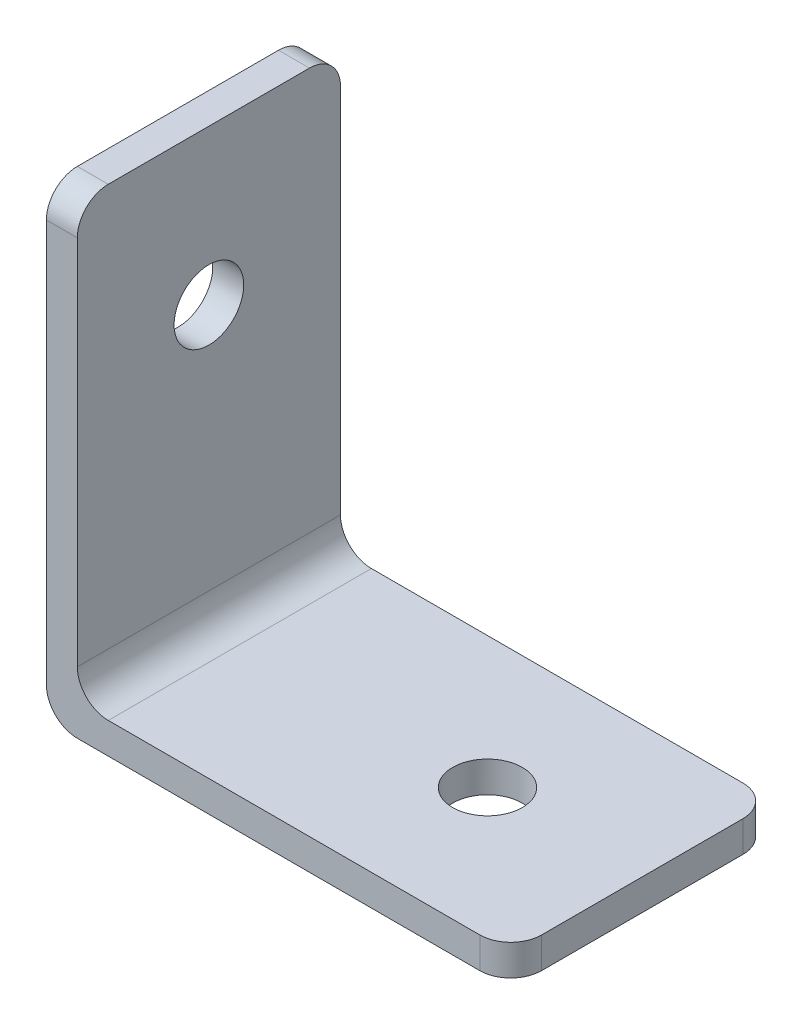
ISO-10303-21;
HEADER;
FILE_DESCRIPTION(('STEP AP214'),'2;1');
FILE_NAME('part.step','',(''),(''),'','','');
FILE_SCHEMA(('AUTOMOTIVE_DESIGN { 1 0 10303 214 1 1 1 1 }'));
ENDSEC;
DATA;
#1=APPLICATION_CONTEXT('core data for automotive mechanical design processes');
#2=APPLICATION_PROTOCOL_DEFINITION('international standard','automotive_design',2000,#1);
#3=PRODUCT_CONTEXT('',#1,'mechanical');
#4=PRODUCT('Part','Part','',(#3));
#5=PRODUCT_RELATED_PRODUCT_CATEGORY('part','',(#4));
#6=PRODUCT_DEFINITION_FORMATION('','',#4);
#7=PRODUCT_DEFINITION_CONTEXT('part definition',#1,'design');
#8=PRODUCT_DEFINITION('design','',#6,#7);
#9=PRODUCT_DEFINITION_SHAPE('','',#8);
#10=(LENGTH_UNIT() NAMED_UNIT(*) SI_UNIT(.MILLI.,.METRE.));
#11=(NAMED_UNIT(*) PLANE_ANGLE_UNIT() SI_UNIT($,.RADIAN.));
#12=(NAMED_UNIT(*) SI_UNIT($,.STERADIAN.) SOLID_ANGLE_UNIT());
#13=UNCERTAINTY_MEASURE_WITH_UNIT(LENGTH_MEASURE(1.E-05),#10,'distance_accuracy_value','');
#14=(GEOMETRIC_REPRESENTATION_CONTEXT(3) GLOBAL_UNCERTAINTY_ASSIGNED_CONTEXT((#13)) GLOBAL_UNIT_ASSIGNED_CONTEXT((#10,
#11,#12)) REPRESENTATION_CONTEXT('',''));
#15=CARTESIAN_POINT('',(0.,0.,0.));
#16=DIRECTION('',(0.,0.,1.));
#17=DIRECTION('',(1.,0.,0.));
#18=AXIS2_PLACEMENT_3D('',#15,#16,#17);
#19=CARTESIAN_POINT('',(0.,0.,17.));
#20=DIRECTION('',(0.,1.,0.));
#21=DIRECTION('',(0.,0.,1.));
#22=AXIS2_PLACEMENT_3D('',#19,#20,#21);
#23=PLANE('',#22);
#24=CARTESIAN_POINT('',(20.,0.,8.5));
#25=DIRECTION('',(0.,-1.,0.));
#26=DIRECTION('',(0.,0.,-1.));
#27=AXIS2_PLACEMENT_3D('',#24,#25,#26);
#28=CIRCLE('',#27,2.25);
#29=CARTESIAN_POINT('',(20.,0.,6.25));
#30=VERTEX_POINT('',#29);
#31=EDGE_CURVE('E394',#30,#30,#28,.T.);
#32=ORIENTED_EDGE('',*,*,#31,.F.);
#33=EDGE_LOOP('',(#32));
#34=FACE_BOUND('',#33,.T.);
#35=DIRECTION('',(1.,0.,0.));
#36=VECTOR('',#35,1.);
#37=CARTESIAN_POINT('',(0.,0.,17.));
#38=LINE('',#37,#36);
#39=CARTESIAN_POINT('',(2.,0.,17.));
#40=VERTEX_POINT('',#39);
#41=CARTESIAN_POINT('',(28.,0.,17.));
#42=VERTEX_POINT('',#41);
#43=EDGE_CURVE('E215',#40,#42,#38,.T.);
#44=ORIENTED_EDGE('',*,*,#43,.F.);
#45=DIRECTION('',(0.,0.,-1.));
#46=VECTOR('',#45,1.);
#47=CARTESIAN_POINT('',(2.,0.,17.));
#48=LINE('',#47,#46);
#49=CARTESIAN_POINT('',(2.,0.,0.));
#50=VERTEX_POINT('',#49);
#51=EDGE_CURVE('E180',#40,#50,#48,.T.);
#52=ORIENTED_EDGE('',*,*,#51,.T.);
#53=DIRECTION('',(1.,0.,0.));
#54=VECTOR('',#53,1.);
#55=CARTESIAN_POINT('',(0.,0.,0.));
#56=LINE('',#55,#54);
#57=CARTESIAN_POINT('',(28.,0.,0.));
#58=VERTEX_POINT('',#57);
#59=EDGE_CURVE('E203',#50,#58,#56,.T.);
#60=ORIENTED_EDGE('',*,*,#59,.T.);
#61=CARTESIAN_POINT('',(28.,0.,2.));
#62=DIRECTION('',(0.,1.,0.));
#63=DIRECTION('',(0.,0.,1.));
#64=AXIS2_PLACEMENT_3D('',#61,#62,#63);
#65=CIRCLE('',#64,2.);
#66=CARTESIAN_POINT('',(30.,0.,2.));
#67=VERTEX_POINT('',#66);
#68=EDGE_CURVE('E150',#58,#67,#65,.F.);
#69=ORIENTED_EDGE('',*,*,#68,.T.);
#70=DIRECTION('',(0.,0.,-1.));
#71=VECTOR('',#70,1.);
#72=CARTESIAN_POINT('',(30.,0.,17.));
#73=LINE('',#72,#71);
#74=CARTESIAN_POINT('',(30.,0.,15.));
#75=VERTEX_POINT('',#74);
#76=EDGE_CURVE('E144',#75,#67,#73,.T.);
#77=ORIENTED_EDGE('',*,*,#76,.F.);
#78=CARTESIAN_POINT('',(28.,0.,15.));
#79=DIRECTION('',(0.,1.,0.));
#80=DIRECTION('',(0.,0.,1.));
#81=AXIS2_PLACEMENT_3D('',#78,#79,#80);
#82=CIRCLE('',#81,2.);
#83=EDGE_CURVE('E149',#75,#42,#82,.F.);
#84=ORIENTED_EDGE('',*,*,#83,.T.);
#85=EDGE_LOOP('',(#44,#52,#60,#69,#77,#84));
#86=FACE_BOUND('',#85,.T.);
#87=ADVANCED_FACE('F33',(#34,#86),#23,.F.);
#88=CARTESIAN_POINT('',(30.,2.,17.));
#89=DIRECTION('',(1.,0.,0.));
#90=DIRECTION('',(0.,0.,-1.));
#91=AXIS2_PLACEMENT_3D('',#88,#89,#90);
#92=PLANE('',#91);
#93=DIRECTION('',(0.,0.,-1.));
#94=VECTOR('',#93,1.);
#95=CARTESIAN_POINT('',(30.,2.,17.));
#96=LINE('',#95,#94);
#97=CARTESIAN_POINT('',(30.,2.,15.));
#98=VERTEX_POINT('',#97);
#99=CARTESIAN_POINT('',(30.,2.,2.));
#100=VERTEX_POINT('',#99);
#101=EDGE_CURVE('E126',#98,#100,#96,.T.);
#102=ORIENTED_EDGE('',*,*,#101,.F.);
#103=DIRECTION('',(0.,-1.,0.));
#104=VECTOR('',#103,1.);
#105=CARTESIAN_POINT('',(30.,0.,15.));
#106=LINE('',#105,#104);
#107=EDGE_CURVE('E140',#98,#75,#106,.T.);
#108=ORIENTED_EDGE('',*,*,#107,.T.);
#109=ORIENTED_EDGE('',*,*,#76,.T.);
#110=DIRECTION('',(0.,-1.,0.));
#111=VECTOR('',#110,1.);
#112=CARTESIAN_POINT('',(30.,2.,2.));
#113=LINE('',#112,#111);
#114=EDGE_CURVE('E143',#67,#100,#113,.F.);
#115=ORIENTED_EDGE('',*,*,#114,.T.);
#116=EDGE_LOOP('',(#102,#108,#109,#115));
#117=FACE_BOUND('',#116,.T.);
#118=ADVANCED_FACE('F138',(#117),#92,.T.);
#119=CARTESIAN_POINT('',(0.,2.,17.));
#120=DIRECTION('',(0.,1.,0.));
#121=DIRECTION('',(0.,0.,1.));
#122=AXIS2_PLACEMENT_3D('',#119,#120,#121);
#123=PLANE('',#122);
#124=CARTESIAN_POINT('',(20.,2.,8.5));
#125=DIRECTION('',(0.,1.,0.));
#126=DIRECTION('',(0.,0.,1.));
#127=AXIS2_PLACEMENT_3D('',#124,#125,#126);
#128=CIRCLE('',#127,2.25);
#129=CARTESIAN_POINT('',(20.,2.,10.75));
#130=VERTEX_POINT('',#129);
#131=EDGE_CURVE('E37',#130,#130,#128,.T.);
#132=ORIENTED_EDGE('',*,*,#131,.F.);
#133=EDGE_LOOP('',(#132));
#134=FACE_BOUND('',#133,.T.);
#135=DIRECTION('',(1.,0.,0.));
#136=VECTOR('',#135,1.);
#137=CARTESIAN_POINT('',(0.,2.,0.));
#138=LINE('',#137,#136);
#139=CARTESIAN_POINT('',(4.,2.,0.));
#140=VERTEX_POINT('',#139);
#141=CARTESIAN_POINT('',(28.,2.,0.));
#142=VERTEX_POINT('',#141);
#143=EDGE_CURVE('E197',#140,#142,#138,.T.);
#144=ORIENTED_EDGE('',*,*,#143,.F.);
#145=DIRECTION('',(0.,0.,-1.));
#146=VECTOR('',#145,1.);
#147=CARTESIAN_POINT('',(4.,2.,17.));
#148=LINE('',#147,#146);
#149=CARTESIAN_POINT('',(4.,2.,17.));
#150=VERTEX_POINT('',#149);
#151=EDGE_CURVE('E55',#140,#150,#148,.F.);
#152=ORIENTED_EDGE('',*,*,#151,.T.);
#153=DIRECTION('',(1.,0.,0.));
#154=VECTOR('',#153,1.);
#155=CARTESIAN_POINT('',(0.,2.,17.));
#156=LINE('',#155,#154);
#157=CARTESIAN_POINT('',(28.,2.,17.));
#158=VERTEX_POINT('',#157);
#159=EDGE_CURVE('E128',#150,#158,#156,.T.);
#160=ORIENTED_EDGE('',*,*,#159,.T.);
#161=CARTESIAN_POINT('',(28.,2.,15.));
#162=DIRECTION('',(0.,1.,0.));
#163=DIRECTION('',(0.,0.,1.));
#164=AXIS2_PLACEMENT_3D('',#161,#162,#163);
#165=CIRCLE('',#164,2.);
#166=EDGE_CURVE('E122',#158,#98,#165,.T.);
#167=ORIENTED_EDGE('',*,*,#166,.T.);
#168=ORIENTED_EDGE('',*,*,#101,.T.);
#169=CARTESIAN_POINT('',(28.,2.,2.));
#170=DIRECTION('',(0.,1.,0.));
#171=DIRECTION('',(0.,0.,1.));
#172=AXIS2_PLACEMENT_3D('',#169,#170,#171);
#173=CIRCLE('',#172,2.);
#174=EDGE_CURVE('E134',#100,#142,#173,.T.);
#175=ORIENTED_EDGE('',*,*,#174,.T.);
#176=EDGE_LOOP('',(#144,#152,#160,#167,#168,#175));
#177=FACE_BOUND('',#176,.T.);
#178=ADVANCED_FACE('F124',(#134,#177),#123,.T.);
#179=CARTESIAN_POINT('',(2.,30.,17.));
#180=DIRECTION('',(1.,0.,0.));
#181=DIRECTION('',(0.,0.,-1.));
#182=AXIS2_PLACEMENT_3D('',#179,#180,#181);
#183=PLANE('',#182);
#184=CARTESIAN_POINT('',(2.,20.,8.5));
#185=DIRECTION('',(1.,0.,0.));
#186=DIRECTION('',(0.,0.,-1.));
#187=AXIS2_PLACEMENT_3D('',#184,#185,#186);
#188=CIRCLE('',#187,2.25);
#189=CARTESIAN_POINT('',(2.,20.,6.25));
#190=VERTEX_POINT('',#189);
#191=EDGE_CURVE('E219',#190,#190,#188,.T.);
#192=ORIENTED_EDGE('',*,*,#191,.F.);
#193=EDGE_LOOP('',(#192));
#194=FACE_BOUND('',#193,.T.);
#195=DIRECTION('',(0.,1.,0.));
#196=VECTOR('',#195,1.);
#197=CARTESIAN_POINT('',(2.,30.,17.));
#198=LINE('',#197,#196);
#199=CARTESIAN_POINT('',(2.,28.,17.));
#200=VERTEX_POINT('',#199);
#201=CARTESIAN_POINT('',(2.,4.,17.));
#202=VERTEX_POINT('',#201);
#203=EDGE_CURVE('E207',#200,#202,#198,.F.);
#204=ORIENTED_EDGE('',*,*,#203,.T.);
#205=DIRECTION('',(0.,0.,-1.));
#206=VECTOR('',#205,1.);
#207=CARTESIAN_POINT('',(2.,4.,0.));
#208=LINE('',#207,#206);
#209=CARTESIAN_POINT('',(2.,4.,0.));
#210=VERTEX_POINT('',#209);
#211=EDGE_CURVE('E189',#202,#210,#208,.T.);
#212=ORIENTED_EDGE('',*,*,#211,.T.);
#213=DIRECTION('',(0.,1.,0.));
#214=VECTOR('',#213,1.);
#215=CARTESIAN_POINT('',(2.,30.,0.));
#216=LINE('',#215,#214);
#217=CARTESIAN_POINT('',(2.,28.,0.));
#218=VERTEX_POINT('',#217);
#219=EDGE_CURVE('E199',#218,#210,#216,.F.);
#220=ORIENTED_EDGE('',*,*,#219,.F.);
#221=CARTESIAN_POINT('',(2.,28.,2.));
#222=DIRECTION('',(1.,0.,0.));
#223=DIRECTION('',(0.,0.,-1.));
#224=AXIS2_PLACEMENT_3D('',#221,#222,#223);
#225=CIRCLE('',#224,2.);
#226=CARTESIAN_POINT('',(2.,30.,2.));
#227=VERTEX_POINT('',#226);
#228=EDGE_CURVE('E172',#218,#227,#225,.T.);
#229=ORIENTED_EDGE('',*,*,#228,.T.);
#230=DIRECTION('',(0.,0.,-1.));
#231=VECTOR('',#230,1.);
#232=CARTESIAN_POINT('',(2.,30.,17.));
#233=LINE('',#232,#231);
#234=CARTESIAN_POINT('',(2.,30.,15.));
#235=VERTEX_POINT('',#234);
#236=EDGE_CURVE('E145',#235,#227,#233,.T.);
#237=ORIENTED_EDGE('',*,*,#236,.F.);
#238=CARTESIAN_POINT('',(2.,28.,15.));
#239=DIRECTION('',(1.,0.,0.));
#240=DIRECTION('',(0.,0.,-1.));
#241=AXIS2_PLACEMENT_3D('',#238,#239,#240);
#242=CIRCLE('',#241,2.);
#243=EDGE_CURVE('E174',#235,#200,#242,.T.);
#244=ORIENTED_EDGE('',*,*,#243,.T.);
#245=EDGE_LOOP('',(#204,#212,#220,#229,#237,#244));
#246=FACE_BOUND('',#245,.T.);
#247=ADVANCED_FACE('F206',(#194,#246),#183,.T.);
#248=CARTESIAN_POINT('',(0.,30.,17.));
#249=DIRECTION('',(0.,1.,0.));
#250=DIRECTION('',(0.,0.,1.));
#251=AXIS2_PLACEMENT_3D('',#248,#249,#250);
#252=PLANE('',#251);
#253=DIRECTION('',(0.,0.,-1.));
#254=VECTOR('',#253,1.);
#255=CARTESIAN_POINT('',(0.,30.,17.));
#256=LINE('',#255,#254);
#257=CARTESIAN_POINT('',(0.,30.,15.));
#258=VERTEX_POINT('',#257);
#259=CARTESIAN_POINT('',(0.,30.,2.));
#260=VERTEX_POINT('',#259);
#261=EDGE_CURVE('E213',#258,#260,#256,.T.);
#262=ORIENTED_EDGE('',*,*,#261,.F.);
#263=DIRECTION('',(1.,0.,0.));
#264=VECTOR('',#263,1.);
#265=CARTESIAN_POINT('',(2.,30.,15.));
#266=LINE('',#265,#264);
#267=EDGE_CURVE('E169',#258,#235,#266,.T.);
#268=ORIENTED_EDGE('',*,*,#267,.T.);
#269=ORIENTED_EDGE('',*,*,#236,.T.);
#270=DIRECTION('',(1.,0.,0.));
#271=VECTOR('',#270,1.);
#272=CARTESIAN_POINT('',(0.,30.,2.));
#273=LINE('',#272,#271);
#274=EDGE_CURVE('E167',#227,#260,#273,.F.);
#275=ORIENTED_EDGE('',*,*,#274,.T.);
#276=EDGE_LOOP('',(#262,#268,#269,#275));
#277=FACE_BOUND('',#276,.T.);
#278=ADVANCED_FACE('F250',(#277),#252,.T.);
#279=CARTESIAN_POINT('',(0.,30.,17.));
#280=DIRECTION('',(1.,0.,0.));
#281=DIRECTION('',(0.,0.,-1.));
#282=AXIS2_PLACEMENT_3D('',#279,#280,#281);
#283=PLANE('',#282);
#284=CARTESIAN_POINT('',(0.,20.,8.5));
#285=DIRECTION('',(-1.,0.,0.));
#286=DIRECTION('',(0.,0.,1.));
#287=AXIS2_PLACEMENT_3D('',#284,#285,#286);
#288=CIRCLE('',#287,2.25);
#289=CARTESIAN_POINT('',(0.,20.,10.75));
#290=VERTEX_POINT('',#289);
#291=EDGE_CURVE('E396',#290,#290,#288,.T.);
#292=ORIENTED_EDGE('',*,*,#291,.F.);
#293=EDGE_LOOP('',(#292));
#294=FACE_BOUND('',#293,.T.);
#295=DIRECTION('',(0.,-1.,0.));
#296=VECTOR('',#295,1.);
#297=CARTESIAN_POINT('',(0.,30.,0.));
#298=LINE('',#297,#296);
#299=CARTESIAN_POINT('',(0.,28.,0.));
#300=VERTEX_POINT('',#299);
#301=CARTESIAN_POINT('',(0.,2.,0.));
#302=VERTEX_POINT('',#301);
#303=EDGE_CURVE('E222',#300,#302,#298,.T.);
#304=ORIENTED_EDGE('',*,*,#303,.T.);
#305=DIRECTION('',(0.,0.,-1.));
#306=VECTOR('',#305,1.);
#307=CARTESIAN_POINT('',(0.,2.,17.));
#308=LINE('',#307,#306);
#309=CARTESIAN_POINT('',(0.,2.,17.));
#310=VERTEX_POINT('',#309);
#311=EDGE_CURVE('E185',#302,#310,#308,.F.);
#312=ORIENTED_EDGE('',*,*,#311,.T.);
#313=DIRECTION('',(0.,-1.,0.));
#314=VECTOR('',#313,1.);
#315=CARTESIAN_POINT('',(0.,30.,17.));
#316=LINE('',#315,#314);
#317=CARTESIAN_POINT('',(0.,28.,17.));
#318=VERTEX_POINT('',#317);
#319=EDGE_CURVE('E210',#318,#310,#316,.T.);
#320=ORIENTED_EDGE('',*,*,#319,.F.);
#321=CARTESIAN_POINT('',(0.,28.,15.));
#322=DIRECTION('',(1.,0.,0.));
#323=DIRECTION('',(0.,0.,-1.));
#324=AXIS2_PLACEMENT_3D('',#321,#322,#323);
#325=CIRCLE('',#324,2.);
#326=EDGE_CURVE('E178',#318,#258,#325,.F.);
#327=ORIENTED_EDGE('',*,*,#326,.T.);
#328=ORIENTED_EDGE('',*,*,#261,.T.);
#329=CARTESIAN_POINT('',(0.,28.,2.));
#330=DIRECTION('',(1.,0.,0.));
#331=DIRECTION('',(0.,0.,-1.));
#332=AXIS2_PLACEMENT_3D('',#329,#330,#331);
#333=CIRCLE('',#332,2.);
#334=EDGE_CURVE('E176',#260,#300,#333,.F.);
#335=ORIENTED_EDGE('',*,*,#334,.T.);
#336=EDGE_LOOP('',(#304,#312,#320,#327,#328,#335));
#337=FACE_BOUND('',#336,.T.);
#338=ADVANCED_FACE('F241',(#294,#337),#283,.F.);
#339=CARTESIAN_POINT('',(0.,0.,17.));
#340=DIRECTION('',(0.,0.,-1.));
#341=DIRECTION('',(-1.,0.,0.));
#342=AXIS2_PLACEMENT_3D('',#339,#340,#341);
#343=PLANE('',#342);
#344=ORIENTED_EDGE('',*,*,#319,.T.);
#345=CARTESIAN_POINT('',(2.,2.,17.));
#346=DIRECTION('',(0.,0.,-1.));
#347=DIRECTION('',(-1.,0.,0.));
#348=AXIS2_PLACEMENT_3D('',#345,#346,#347);
#349=CIRCLE('',#348,2.);
#350=EDGE_CURVE('E187',#310,#40,#349,.F.);
#351=ORIENTED_EDGE('',*,*,#350,.T.);
#352=ORIENTED_EDGE('',*,*,#43,.T.);
#353=DIRECTION('',(0.,-1.,0.));
#354=VECTOR('',#353,1.);
#355=CARTESIAN_POINT('',(28.,2.,17.));
#356=LINE('',#355,#354);
#357=EDGE_CURVE('E159',#42,#158,#356,.F.);
#358=ORIENTED_EDGE('',*,*,#357,.T.);
#359=ORIENTED_EDGE('',*,*,#159,.F.);
#360=CARTESIAN_POINT('',(4.,4.,17.));
#361=DIRECTION('',(0.,0.,-1.));
#362=DIRECTION('',(-1.,0.,0.));
#363=AXIS2_PLACEMENT_3D('',#360,#361,#362);
#364=CIRCLE('',#363,2.);
#365=EDGE_CURVE('E11',#150,#202,#364,.T.);
#366=ORIENTED_EDGE('',*,*,#365,.T.);
#367=ORIENTED_EDGE('',*,*,#203,.F.);
#368=DIRECTION('',(1.,0.,0.));
#369=VECTOR('',#368,1.);
#370=CARTESIAN_POINT('',(0.,28.,17.));
#371=LINE('',#370,#369);
#372=EDGE_CURVE('E157',#200,#318,#371,.F.);
#373=ORIENTED_EDGE('',*,*,#372,.T.);
#374=EDGE_LOOP('',(#344,#351,#352,#358,#359,#366,#367,#373));
#375=FACE_BOUND('',#374,.T.);
#376=ADVANCED_FACE('F243',(#375),#343,.F.);
#377=CARTESIAN_POINT('',(0.,0.,0.));
#378=DIRECTION('',(0.,0.,-1.));
#379=DIRECTION('',(-1.,0.,0.));
#380=AXIS2_PLACEMENT_3D('',#377,#378,#379);
#381=PLANE('',#380);
#382=ORIENTED_EDGE('',*,*,#59,.F.);
#383=CARTESIAN_POINT('',(2.,2.,0.));
#384=DIRECTION('',(0.,0.,-1.));
#385=DIRECTION('',(-1.,0.,0.));
#386=AXIS2_PLACEMENT_3D('',#383,#384,#385);
#387=CIRCLE('',#386,2.);
#388=EDGE_CURVE('E183',#50,#302,#387,.T.);
#389=ORIENTED_EDGE('',*,*,#388,.T.);
#390=ORIENTED_EDGE('',*,*,#303,.F.);
#391=DIRECTION('',(1.,0.,0.));
#392=VECTOR('',#391,1.);
#393=CARTESIAN_POINT('',(0.,28.,0.));
#394=LINE('',#393,#392);
#395=EDGE_CURVE('E133',#300,#218,#394,.T.);
#396=ORIENTED_EDGE('',*,*,#395,.T.);
#397=ORIENTED_EDGE('',*,*,#219,.T.);
#398=CARTESIAN_POINT('',(4.,4.,0.));
#399=DIRECTION('',(0.,0.,-1.));
#400=DIRECTION('',(-1.,0.,0.));
#401=AXIS2_PLACEMENT_3D('',#398,#399,#400);
#402=CIRCLE('',#401,2.);
#403=EDGE_CURVE('E42',#210,#140,#402,.F.);
#404=ORIENTED_EDGE('',*,*,#403,.T.);
#405=ORIENTED_EDGE('',*,*,#143,.T.);
#406=DIRECTION('',(0.,-1.,0.));
#407=VECTOR('',#406,1.);
#408=CARTESIAN_POINT('',(28.,0.,0.));
#409=LINE('',#408,#407);
#410=EDGE_CURVE('E164',#142,#58,#409,.T.);
#411=ORIENTED_EDGE('',*,*,#410,.T.);
#412=EDGE_LOOP('',(#382,#389,#390,#396,#397,#404,#405,#411));
#413=FACE_BOUND('',#412,.T.);
#414=ADVANCED_FACE('F196',(#413),#381,.T.);
#415=CARTESIAN_POINT('',(28.,2.,15.));
#416=DIRECTION('',(0.,1.,0.));
#417=DIRECTION('',(0.,0.,1.));
#418=AXIS2_PLACEMENT_3D('',#415,#416,#417);
#419=CYLINDRICAL_SURFACE('',#418,2.);
#420=ORIENTED_EDGE('',*,*,#166,.F.);
#421=ORIENTED_EDGE('',*,*,#357,.F.);
#422=ORIENTED_EDGE('',*,*,#83,.F.);
#423=ORIENTED_EDGE('',*,*,#107,.F.);
#424=EDGE_LOOP('',(#420,#421,#422,#423));
#425=FACE_BOUND('',#424,.T.);
#426=ADVANCED_FACE('F147',(#425),#419,.T.);
#427=CARTESIAN_POINT('',(28.,0.,2.));
#428=DIRECTION('',(0.,-1.,0.));
#429=DIRECTION('',(0.,0.,-1.));
#430=AXIS2_PLACEMENT_3D('',#427,#428,#429);
#431=CYLINDRICAL_SURFACE('',#430,2.);
#432=ORIENTED_EDGE('',*,*,#174,.F.);
#433=ORIENTED_EDGE('',*,*,#114,.F.);
#434=ORIENTED_EDGE('',*,*,#68,.F.);
#435=ORIENTED_EDGE('',*,*,#410,.F.);
#436=EDGE_LOOP('',(#432,#433,#434,#435));
#437=FACE_BOUND('',#436,.T.);
#438=ADVANCED_FACE('F231',(#437),#431,.T.);
#439=CARTESIAN_POINT('',(0.,28.,15.));
#440=DIRECTION('',(-1.,0.,0.));
#441=DIRECTION('',(0.,0.,1.));
#442=AXIS2_PLACEMENT_3D('',#439,#440,#441);
#443=CYLINDRICAL_SURFACE('',#442,2.);
#444=ORIENTED_EDGE('',*,*,#326,.F.);
#445=ORIENTED_EDGE('',*,*,#372,.F.);
#446=ORIENTED_EDGE('',*,*,#243,.F.);
#447=ORIENTED_EDGE('',*,*,#267,.F.);
#448=EDGE_LOOP('',(#444,#445,#446,#447));
#449=FACE_BOUND('',#448,.T.);
#450=ADVANCED_FACE('F245',(#449),#443,.T.);
#451=CARTESIAN_POINT('',(0.,28.,2.));
#452=DIRECTION('',(1.,0.,0.));
#453=DIRECTION('',(0.,0.,-1.));
#454=AXIS2_PLACEMENT_3D('',#451,#452,#453);
#455=CYLINDRICAL_SURFACE('',#454,2.);
#456=ORIENTED_EDGE('',*,*,#334,.F.);
#457=ORIENTED_EDGE('',*,*,#274,.F.);
#458=ORIENTED_EDGE('',*,*,#228,.F.);
#459=ORIENTED_EDGE('',*,*,#395,.F.);
#460=EDGE_LOOP('',(#456,#457,#458,#459));
#461=FACE_BOUND('',#460,.T.);
#462=ADVANCED_FACE('F253',(#461),#455,.T.);
#463=CARTESIAN_POINT('',(2.,2.,17.));
#464=DIRECTION('',(0.,0.,-1.));
#465=DIRECTION('',(-1.,0.,0.));
#466=AXIS2_PLACEMENT_3D('',#463,#464,#465);
#467=CYLINDRICAL_SURFACE('',#466,2.);
#468=ORIENTED_EDGE('',*,*,#350,.F.);
#469=ORIENTED_EDGE('',*,*,#311,.F.);
#470=ORIENTED_EDGE('',*,*,#388,.F.);
#471=ORIENTED_EDGE('',*,*,#51,.F.);
#472=EDGE_LOOP('',(#468,#469,#470,#471));
#473=FACE_BOUND('',#472,.T.);
#474=ADVANCED_FACE('F237',(#473),#467,.T.);
#475=CARTESIAN_POINT('',(4.,4.,17.));
#476=DIRECTION('',(0.,0.,1.));
#477=DIRECTION('',(1.,0.,0.));
#478=AXIS2_PLACEMENT_3D('',#475,#476,#477);
#479=CYLINDRICAL_SURFACE('',#478,2.);
#480=ORIENTED_EDGE('',*,*,#365,.F.);
#481=ORIENTED_EDGE('',*,*,#151,.F.);
#482=ORIENTED_EDGE('',*,*,#403,.F.);
#483=ORIENTED_EDGE('',*,*,#211,.F.);
#484=EDGE_LOOP('',(#480,#481,#482,#483));
#485=FACE_BOUND('',#484,.T.);
#486=ADVANCED_FACE('F35',(#485),#479,.F.);
#487=CARTESIAN_POINT('',(10.,20.,8.5));
#488=DIRECTION('',(-1.,0.,0.));
#489=DIRECTION('',(0.,0.,1.));
#490=AXIS2_PLACEMENT_3D('',#487,#488,#489);
#491=CYLINDRICAL_SURFACE('',#490,2.25);
#492=ORIENTED_EDGE('',*,*,#191,.T.);
#493=EDGE_LOOP('',(#492));
#494=FACE_BOUND('',#493,.T.);
#495=ORIENTED_EDGE('',*,*,#291,.T.);
#496=EDGE_LOOP('',(#495));
#497=FACE_BOUND('',#496,.T.);
#498=ADVANCED_FACE('F321',(#494,#497),#491,.F.);
#499=CARTESIAN_POINT('',(20.,10.,8.5));
#500=DIRECTION('',(0.,-1.,0.));
#501=DIRECTION('',(0.,0.,-1.));
#502=AXIS2_PLACEMENT_3D('',#499,#500,#501);
#503=CYLINDRICAL_SURFACE('',#502,2.25);
#504=ORIENTED_EDGE('',*,*,#131,.T.);
#505=EDGE_LOOP('',(#504));
#506=FACE_BOUND('',#505,.T.);
#507=ORIENTED_EDGE('',*,*,#31,.T.);
#508=EDGE_LOOP('',(#507));
#509=FACE_BOUND('',#508,.T.);
#510=ADVANCED_FACE('F348',(#506,#509),#503,.F.);
#511=CLOSED_SHELL('',(#87,#118,#178,#247,#278,#338,#376,#414,#426,#438,#450,#462,#474,#486,#498,#510));
#512=MANIFOLD_SOLID_BREP('B2',#511);
#513=ADVANCED_BREP_SHAPE_REPRESENTATION('',(#18,#512),#14);
#514=SHAPE_DEFINITION_REPRESENTATION(#9,#513);
ENDSEC;
END-ISO-10303-21;
